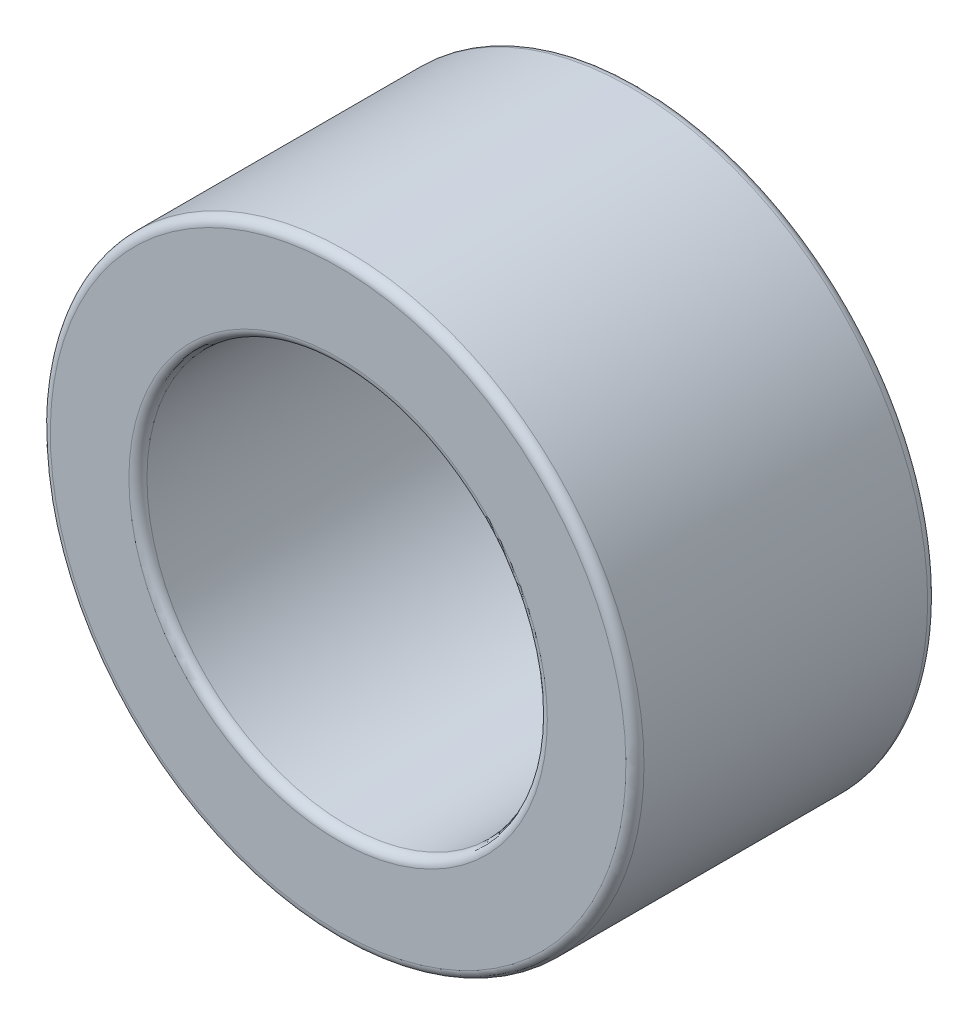
ISO-10303-21;
HEADER;
FILE_DESCRIPTION(('STEP AP214'),'2;1');
FILE_NAME('part.step','',(''),(''),'','','');
FILE_SCHEMA(('AUTOMOTIVE_DESIGN { 1 0 10303 214 1 1 1 1 }'));
ENDSEC;
DATA;
#1=APPLICATION_CONTEXT('core data for automotive mechanical design processes');
#2=APPLICATION_PROTOCOL_DEFINITION('international standard','automotive_design',2000,#1);
#3=PRODUCT_CONTEXT('',#1,'mechanical');
#4=PRODUCT('Part','Part','',(#3));
#5=PRODUCT_RELATED_PRODUCT_CATEGORY('part','',(#4));
#6=PRODUCT_DEFINITION_FORMATION('','',#4);
#7=PRODUCT_DEFINITION_CONTEXT('part definition',#1,'design');
#8=PRODUCT_DEFINITION('design','',#6,#7);
#9=PRODUCT_DEFINITION_SHAPE('','',#8);
#10=(LENGTH_UNIT() NAMED_UNIT(*) SI_UNIT(.MILLI.,.METRE.));
#11=(NAMED_UNIT(*) PLANE_ANGLE_UNIT() SI_UNIT($,.RADIAN.));
#12=(NAMED_UNIT(*) SI_UNIT($,.STERADIAN.) SOLID_ANGLE_UNIT());
#13=UNCERTAINTY_MEASURE_WITH_UNIT(LENGTH_MEASURE(1.E-05),#10,'distance_accuracy_value','');
#14=(GEOMETRIC_REPRESENTATION_CONTEXT(3) GLOBAL_UNCERTAINTY_ASSIGNED_CONTEXT((#13)) GLOBAL_UNIT_ASSIGNED_CONTEXT((#10,
#11,#12)) REPRESENTATION_CONTEXT('',''));
#15=CARTESIAN_POINT('',(0.,0.,0.));
#16=DIRECTION('',(0.,0.,1.));
#17=DIRECTION('',(1.,0.,0.));
#18=AXIS2_PLACEMENT_3D('',#15,#16,#17);
#19=CARTESIAN_POINT('',(22.855590065097,9.525,-0.785));
#20=DIRECTION('',(0.,0.,1.));
#21=DIRECTION('',(1.,0.,0.));
#22=AXIS2_PLACEMENT_3D('',#19,#20,#21);
#23=TOROIDAL_SURFACE('',#22,1.158,0.0499999999999965);
#24=CARTESIAN_POINT('',(22.855590065097,9.525,-0.785));
#25=DIRECTION('',(0.,0.,-1.));
#26=DIRECTION('',(-1.,0.,0.));
#27=AXIS2_PLACEMENT_3D('',#24,#25,#26);
#28=CIRCLE('',#27,1.108);
#29=CARTESIAN_POINT('',(21.747590065097,9.525,-0.785));
#30=VERTEX_POINT('',#29);
#31=EDGE_CURVE('E37',#30,#30,#28,.T.);
#32=ORIENTED_EDGE('',*,*,#31,.F.);
#33=EDGE_LOOP('',(#32));
#34=FACE_BOUND('',#33,.T.);
#35=CARTESIAN_POINT('',(22.855590065097,9.525,-0.834999999999997));
#36=DIRECTION('',(0.,0.,1.));
#37=DIRECTION('',(1.,0.,0.));
#38=AXIS2_PLACEMENT_3D('',#35,#36,#37);
#39=CIRCLE('',#38,1.158);
#40=CARTESIAN_POINT('',(24.013590065097,9.525,-0.834999999999997));
#41=VERTEX_POINT('',#40);
#42=EDGE_CURVE('E18',#41,#41,#39,.T.);
#43=ORIENTED_EDGE('',*,*,#42,.F.);
#44=EDGE_LOOP('',(#43));
#45=FACE_BOUND('',#44,.T.);
#46=ADVANCED_FACE('F14',(#34,#45),#23,.T.);
#47=CARTESIAN_POINT('',(22.855590065097,9.525,-0.785));
#48=DIRECTION('',(0.,0.,1.));
#49=DIRECTION('',(1.,0.,0.));
#50=AXIS2_PLACEMENT_3D('',#47,#48,#49);
#51=CYLINDRICAL_SURFACE('',#50,1.108);
#52=CARTESIAN_POINT('',(22.855590065097,9.525,0.785));
#53=DIRECTION('',(0.,0.,-1.));
#54=DIRECTION('',(-1.,0.,0.));
#55=AXIS2_PLACEMENT_3D('',#52,#53,#54);
#56=CIRCLE('',#55,1.108);
#57=CARTESIAN_POINT('',(21.747590065097,9.525,0.785));
#58=VERTEX_POINT('',#57);
#59=EDGE_CURVE('E33',#58,#58,#56,.T.);
#60=ORIENTED_EDGE('',*,*,#59,.F.);
#61=EDGE_LOOP('',(#60));
#62=FACE_BOUND('',#61,.T.);
#63=ORIENTED_EDGE('',*,*,#31,.T.);
#64=EDGE_LOOP('',(#63));
#65=FACE_BOUND('',#64,.T.);
#66=ADVANCED_FACE('F49',(#62,#65),#51,.F.);
#67=CARTESIAN_POINT('',(24.448590065097,7.90014,-0.835));
#68=DIRECTION('',(0.,0.,-1.));
#69=DIRECTION('',(-1.,0.,0.));
#70=AXIS2_PLACEMENT_3D('',#67,#68,#69);
#71=PLANE('',#70);
#72=ORIENTED_EDGE('',*,*,#42,.T.);
#73=EDGE_LOOP('',(#72));
#74=FACE_BOUND('',#73,.T.);
#75=CARTESIAN_POINT('',(22.855590065097,9.525,-0.834999999999997));
#76=DIRECTION('',(0.,0.,-1.));
#77=DIRECTION('',(-1.,0.,0.));
#78=AXIS2_PLACEMENT_3D('',#75,#76,#77);
#79=CIRCLE('',#78,1.59299999999999);
#80=CARTESIAN_POINT('',(21.262590065097,9.525,-0.834999999999997));
#81=VERTEX_POINT('',#80);
#82=EDGE_CURVE('E36',#81,#81,#79,.F.);
#83=ORIENTED_EDGE('',*,*,#82,.F.);
#84=EDGE_LOOP('',(#83));
#85=FACE_BOUND('',#84,.T.);
#86=ADVANCED_FACE('F46',(#74,#85),#71,.T.);
#87=CARTESIAN_POINT('',(22.855590065097,9.525,0.785));
#88=DIRECTION('',(0.,0.,-1.));
#89=DIRECTION('',(-1.,0.,0.));
#90=AXIS2_PLACEMENT_3D('',#87,#88,#89);
#91=TOROIDAL_SURFACE('',#90,1.158,0.0499999999999997);
#92=ORIENTED_EDGE('',*,*,#59,.T.);
#93=EDGE_LOOP('',(#92));
#94=FACE_BOUND('',#93,.T.);
#95=CARTESIAN_POINT('',(22.855590065097,9.525,0.835));
#96=DIRECTION('',(0.,0.,-1.));
#97=DIRECTION('',(-1.,0.,0.));
#98=AXIS2_PLACEMENT_3D('',#95,#96,#97);
#99=CIRCLE('',#98,1.158);
#100=CARTESIAN_POINT('',(21.697590065097,9.525,0.835));
#101=VERTEX_POINT('',#100);
#102=EDGE_CURVE('E32',#101,#101,#99,.T.);
#103=ORIENTED_EDGE('',*,*,#102,.F.);
#104=EDGE_LOOP('',(#103));
#105=FACE_BOUND('',#104,.T.);
#106=ADVANCED_FACE('F48',(#94,#105),#91,.T.);
#107=CARTESIAN_POINT('',(22.855590065097,9.525,-0.784999999999997));
#108=DIRECTION('',(0.,0.,-1.));
#109=DIRECTION('',(-1.,0.,0.));
#110=AXIS2_PLACEMENT_3D('',#107,#108,#109);
#111=TOROIDAL_SURFACE('',#110,1.593,0.0500000000000005);
#112=CARTESIAN_POINT('',(22.855590065097,9.525,-0.785));
#113=DIRECTION('',(0.,0.,1.));
#114=DIRECTION('',(1.,0.,0.));
#115=AXIS2_PLACEMENT_3D('',#112,#113,#114);
#116=CIRCLE('',#115,1.643);
#117=CARTESIAN_POINT('',(24.498590065097,9.525,-0.785));
#118=VERTEX_POINT('',#117);
#119=EDGE_CURVE('E27',#118,#118,#116,.T.);
#120=ORIENTED_EDGE('',*,*,#119,.F.);
#121=EDGE_LOOP('',(#120));
#122=FACE_BOUND('',#121,.T.);
#123=ORIENTED_EDGE('',*,*,#82,.T.);
#124=EDGE_LOOP('',(#123));
#125=FACE_BOUND('',#124,.T.);
#126=ADVANCED_FACE('F44',(#122,#125),#111,.T.);
#127=CARTESIAN_POINT('',(21.262590065097,7.90014,0.835));
#128=DIRECTION('',(0.,0.,1.));
#129=DIRECTION('',(1.,0.,0.));
#130=AXIS2_PLACEMENT_3D('',#127,#128,#129);
#131=PLANE('',#130);
#132=ORIENTED_EDGE('',*,*,#102,.T.);
#133=EDGE_LOOP('',(#132));
#134=FACE_BOUND('',#133,.T.);
#135=CARTESIAN_POINT('',(22.855590065097,9.525,0.834999999999998));
#136=DIRECTION('',(0.,0.,1.));
#137=DIRECTION('',(0.,-1.,0.));
#138=AXIS2_PLACEMENT_3D('',#135,#136,#137);
#139=CIRCLE('',#138,1.593);
#140=CARTESIAN_POINT('',(22.855590065097,7.932,0.834999999999998));
#141=VERTEX_POINT('',#140);
#142=EDGE_CURVE('E22',#141,#141,#139,.F.);
#143=ORIENTED_EDGE('',*,*,#142,.F.);
#144=EDGE_LOOP('',(#143));
#145=FACE_BOUND('',#144,.T.);
#146=ADVANCED_FACE('F67',(#134,#145),#131,.T.);
#147=CARTESIAN_POINT('',(22.855590065097,9.525,0.785));
#148=DIRECTION('',(0.,0.,-1.));
#149=DIRECTION('',(-1.,0.,0.));
#150=AXIS2_PLACEMENT_3D('',#147,#148,#149);
#151=CYLINDRICAL_SURFACE('',#150,1.643);
#152=ORIENTED_EDGE('',*,*,#119,.T.);
#153=EDGE_LOOP('',(#152));
#154=FACE_BOUND('',#153,.T.);
#155=CARTESIAN_POINT('',(22.855590065097,9.525,0.785));
#156=DIRECTION('',(0.,0.,1.));
#157=DIRECTION('',(1.,0.,0.));
#158=AXIS2_PLACEMENT_3D('',#155,#156,#157);
#159=CIRCLE('',#158,1.643);
#160=CARTESIAN_POINT('',(24.498590065097,9.525,0.785));
#161=VERTEX_POINT('',#160);
#162=EDGE_CURVE('E10',#161,#161,#159,.T.);
#163=ORIENTED_EDGE('',*,*,#162,.F.);
#164=EDGE_LOOP('',(#163));
#165=FACE_BOUND('',#164,.T.);
#166=ADVANCED_FACE('F63',(#154,#165),#151,.T.);
#167=CARTESIAN_POINT('',(22.855590065097,9.525,0.785));
#168=DIRECTION('',(0.,0.,1.));
#169=DIRECTION('',(0.,-1.,0.));
#170=AXIS2_PLACEMENT_3D('',#167,#168,#169);
#171=TOROIDAL_SURFACE('',#170,1.59300000000001,0.0499999999999982);
#172=ORIENTED_EDGE('',*,*,#162,.T.);
#173=EDGE_LOOP('',(#172));
#174=FACE_BOUND('',#173,.T.);
#175=ORIENTED_EDGE('',*,*,#142,.T.);
#176=EDGE_LOOP('',(#175));
#177=FACE_BOUND('',#176,.T.);
#178=ADVANCED_FACE('F16',(#174,#177),#171,.T.);
#179=CLOSED_SHELL('',(#46,#66,#86,#106,#126,#146,#166,#178));
#180=MANIFOLD_SOLID_BREP('B1',#179);
#181=ADVANCED_BREP_SHAPE_REPRESENTATION('',(#18,#180),#14);
#182=SHAPE_DEFINITION_REPRESENTATION(#9,#181);
ENDSEC;
END-ISO-10303-21;
